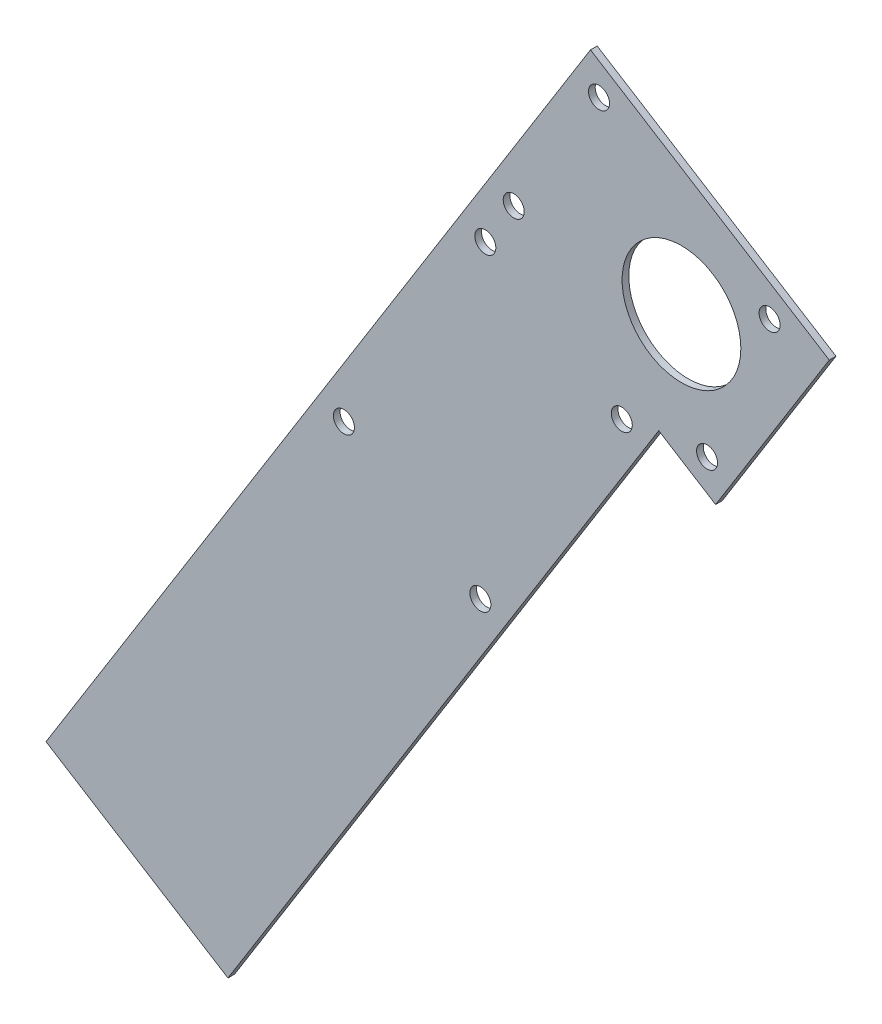
ISO-10303-21;
HEADER;
FILE_DESCRIPTION(('STEP AP214'),'2;1');
FILE_NAME('part.step','',(''),(''),'','','');
FILE_SCHEMA(('AUTOMOTIVE_DESIGN { 1 0 10303 214 1 1 1 1 }'));
ENDSEC;
DATA;
#1=APPLICATION_CONTEXT('core data for automotive mechanical design processes');
#2=APPLICATION_PROTOCOL_DEFINITION('international standard','automotive_design',2000,#1);
#3=PRODUCT_CONTEXT('',#1,'mechanical');
#4=PRODUCT('Part','Part','',(#3));
#5=PRODUCT_RELATED_PRODUCT_CATEGORY('part','',(#4));
#6=PRODUCT_DEFINITION_FORMATION('','',#4);
#7=PRODUCT_DEFINITION_CONTEXT('part definition',#1,'design');
#8=PRODUCT_DEFINITION('design','',#6,#7);
#9=PRODUCT_DEFINITION_SHAPE('','',#8);
#10=(LENGTH_UNIT() NAMED_UNIT(*) SI_UNIT(.MILLI.,.METRE.));
#11=(NAMED_UNIT(*) PLANE_ANGLE_UNIT() SI_UNIT($,.RADIAN.));
#12=(NAMED_UNIT(*) SI_UNIT($,.STERADIAN.) SOLID_ANGLE_UNIT());
#13=UNCERTAINTY_MEASURE_WITH_UNIT(LENGTH_MEASURE(1.E-05),#10,'distance_accuracy_value','');
#14=(GEOMETRIC_REPRESENTATION_CONTEXT(3) GLOBAL_UNCERTAINTY_ASSIGNED_CONTEXT((#13)) GLOBAL_UNIT_ASSIGNED_CONTEXT((#10,
#11,#12)) REPRESENTATION_CONTEXT('',''));
#15=CARTESIAN_POINT('',(0.,0.,0.));
#16=DIRECTION('',(0.,0.,1.));
#17=DIRECTION('',(1.,0.,0.));
#18=AXIS2_PLACEMENT_3D('',#15,#16,#17);
#19=CARTESIAN_POINT('',(14.1408265628746,-61.2506491733274,374.386380443167));
#20=DIRECTION('',(-0.848048096019243,0.529919264452743,0.));
#21=DIRECTION('',(-0.529919264452743,-0.848048096019243,0.));
#22=AXIS2_PLACEMENT_3D('',#19,#20,#21);
#23=PLANE('',#22);
#24=DIRECTION('',(-0.529919264452743,-0.848048096019243,0.));
#25=VECTOR('',#24,1.);
#26=CARTESIAN_POINT('',(14.1408265628746,-61.2506491733274,375.973880443167));
#27=LINE('',#26,#25);
#28=CARTESIAN_POINT('',(14.1408265628746,-61.2506491733274,375.973880443167));
#29=VERTEX_POINT('',#28);
#30=CARTESIAN_POINT('',(-87.8513112735362,-224.472188949626,375.973880443167));
#31=VERTEX_POINT('',#30);
#32=EDGE_CURVE('E121',#29,#31,#27,.T.);
#33=ORIENTED_EDGE('',*,*,#32,.T.);
#34=DIRECTION('',(0.,0.,1.));
#35=VECTOR('',#34,1.);
#36=CARTESIAN_POINT('',(-87.8513112735362,-224.472188949626,374.386380443167));
#37=LINE('',#36,#35);
#38=CARTESIAN_POINT('',(-87.8513112735362,-224.472188949626,374.386380443167));
#39=VERTEX_POINT('',#38);
#40=EDGE_CURVE('E11',#39,#31,#37,.T.);
#41=ORIENTED_EDGE('',*,*,#40,.F.);
#42=DIRECTION('',(-0.529919264452743,-0.848048096019243,0.));
#43=VECTOR('',#42,1.);
#44=CARTESIAN_POINT('',(14.1408265628746,-61.2506491733274,374.386380443167));
#45=LINE('',#44,#43);
#46=CARTESIAN_POINT('',(14.1408265628746,-61.2506491733274,374.386380443167));
#47=VERTEX_POINT('',#46);
#48=EDGE_CURVE('E132',#47,#39,#45,.T.);
#49=ORIENTED_EDGE('',*,*,#48,.F.);
#50=DIRECTION('',(0.,0.,1.));
#51=VECTOR('',#50,1.);
#52=CARTESIAN_POINT('',(14.1408265628746,-61.2506491733274,374.386380443167));
#53=LINE('',#52,#51);
#54=EDGE_CURVE('E117',#47,#29,#53,.T.);
#55=ORIENTED_EDGE('',*,*,#54,.T.);
#56=EDGE_LOOP('',(#33,#41,#49,#55));
#57=FACE_BOUND('',#56,.T.);
#58=ADVANCED_FACE('F37',(#57),#23,.F.);
#59=CARTESIAN_POINT('',(-87.8513112735362,-224.472188949626,374.386380443167));
#60=DIRECTION('',(0.529919264452743,0.848048096019244,0.));
#61=DIRECTION('',(-0.848048096019244,0.529919264452743,0.));
#62=AXIS2_PLACEMENT_3D('',#59,#60,#61);
#63=PLANE('',#62);
#64=DIRECTION('',(-0.848048096019244,0.529919264452743,0.));
#65=VECTOR('',#64,1.);
#66=CARTESIAN_POINT('',(-87.8513112735362,-224.472188949626,375.973880443167));
#67=LINE('',#66,#65);
#68=CARTESIAN_POINT('',(-130.932154551314,-197.552290315427,375.973880443167));
#69=VERTEX_POINT('',#68);
#70=EDGE_CURVE('E124',#31,#69,#67,.T.);
#71=ORIENTED_EDGE('',*,*,#70,.T.);
#72=DIRECTION('',(0.,0.,1.));
#73=VECTOR('',#72,1.);
#74=CARTESIAN_POINT('',(-130.932154551314,-197.552290315427,374.386380443167));
#75=LINE('',#74,#73);
#76=CARTESIAN_POINT('',(-130.932154551314,-197.552290315427,374.386380443167));
#77=VERTEX_POINT('',#76);
#78=EDGE_CURVE('E45',#77,#69,#75,.T.);
#79=ORIENTED_EDGE('',*,*,#78,.F.);
#80=DIRECTION('',(-0.848048096019244,0.529919264452743,0.));
#81=VECTOR('',#80,1.);
#82=CARTESIAN_POINT('',(-87.8513112735362,-224.472188949626,374.386380443167));
#83=LINE('',#82,#81);
#84=EDGE_CURVE('E90',#39,#77,#83,.T.);
#85=ORIENTED_EDGE('',*,*,#84,.F.);
#86=ORIENTED_EDGE('',*,*,#40,.T.);
#87=EDGE_LOOP('',(#71,#79,#85,#86));
#88=FACE_BOUND('',#87,.T.);
#89=ADVANCED_FACE('F157',(#88),#63,.F.);
#90=CARTESIAN_POINT('',(-130.932154551314,-197.552290315427,374.386380443167));
#91=DIRECTION('',(0.848048096019243,-0.529919264452744,0.));
#92=DIRECTION('',(0.529919264452744,0.848048096019243,0.));
#93=AXIS2_PLACEMENT_3D('',#90,#91,#92);
#94=PLANE('',#93);
#95=DIRECTION('',(0.529919264452744,0.848048096019243,0.));
#96=VECTOR('',#95,1.);
#97=CARTESIAN_POINT('',(-130.932154551314,-197.552290315427,375.973880443167));
#98=LINE('',#97,#96);
#99=CARTESIAN_POINT('',(-2.02011808070356,8.75009273864942,375.973880443167));
#100=VERTEX_POINT('',#99);
#101=EDGE_CURVE('E127',#69,#100,#98,.T.);
#102=ORIENTED_EDGE('',*,*,#101,.T.);
#103=DIRECTION('',(0.,0.,1.));
#104=VECTOR('',#103,1.);
#105=CARTESIAN_POINT('',(-2.02011808070356,8.75009273864942,374.386380443167));
#106=LINE('',#105,#104);
#107=CARTESIAN_POINT('',(-2.02011808070356,8.75009273864942,374.386380443167));
#108=VERTEX_POINT('',#107);
#109=EDGE_CURVE('E112',#108,#100,#106,.T.);
#110=ORIENTED_EDGE('',*,*,#109,.F.);
#111=DIRECTION('',(0.529919264452744,0.848048096019243,0.));
#112=VECTOR('',#111,1.);
#113=CARTESIAN_POINT('',(-130.932154551314,-197.552290315427,374.386380443167));
#114=LINE('',#113,#112);
#115=EDGE_CURVE('E103',#77,#108,#114,.T.);
#116=ORIENTED_EDGE('',*,*,#115,.F.);
#117=ORIENTED_EDGE('',*,*,#78,.T.);
#118=EDGE_LOOP('',(#102,#110,#116,#117));
#119=FACE_BOUND('',#118,.T.);
#120=ADVANCED_FACE('F138',(#119),#94,.F.);
#121=CARTESIAN_POINT('',(-2.02011808070356,8.75009273864942,374.386380443167));
#122=DIRECTION('',(-0.529919264452743,-0.848048096019244,0.));
#123=DIRECTION('',(0.848048096019244,-0.529919264452743,0.));
#124=AXIS2_PLACEMENT_3D('',#121,#122,#123);
#125=PLANE('',#124);
#126=DIRECTION('',(0.848048096019244,-0.529919264452743,0.));
#127=VECTOR('',#126,1.);
#128=CARTESIAN_POINT('',(-2.02011808070356,8.75009273864942,375.973880443167));
#129=LINE('',#128,#127);
#130=CARTESIAN_POINT('',(54.5234887213794,-26.5822742187371,375.973880443167));
#131=VERTEX_POINT('',#130);
#132=EDGE_CURVE('E111',#100,#131,#129,.T.);
#133=ORIENTED_EDGE('',*,*,#132,.T.);
#134=DIRECTION('',(0.,0.,1.));
#135=VECTOR('',#134,1.);
#136=CARTESIAN_POINT('',(54.5234887213794,-26.5822742187371,374.386380443167));
#137=LINE('',#136,#135);
#138=CARTESIAN_POINT('',(54.5234887213794,-26.5822742187371,374.386380443167));
#139=VERTEX_POINT('',#138);
#140=EDGE_CURVE('E108',#139,#131,#137,.T.);
#141=ORIENTED_EDGE('',*,*,#140,.F.);
#142=DIRECTION('',(0.848048096019244,-0.529919264452743,0.));
#143=VECTOR('',#142,1.);
#144=CARTESIAN_POINT('',(-2.02011808070356,8.75009273864942,374.386380443167));
#145=LINE('',#144,#143);
#146=EDGE_CURVE('E97',#108,#139,#145,.T.);
#147=ORIENTED_EDGE('',*,*,#146,.F.);
#148=ORIENTED_EDGE('',*,*,#109,.T.);
#149=EDGE_LOOP('',(#133,#141,#147,#148));
#150=FACE_BOUND('',#149,.T.);
#151=ADVANCED_FACE('F109',(#150),#125,.F.);
#152=CARTESIAN_POINT('',(54.5234887213794,-26.5822742187371,374.386380443167));
#153=DIRECTION('',(-0.848048096019244,0.529919264452743,0.));
#154=DIRECTION('',(-0.529919264452743,-0.848048096019244,0.));
#155=AXIS2_PLACEMENT_3D('',#152,#153,#154);
#156=PLANE('',#155);
#157=DIRECTION('',(-0.529919264452743,-0.848048096019244,0.));
#158=VECTOR('',#157,1.);
#159=CARTESIAN_POINT('',(54.5234887213794,-26.5822742187371,375.973880443167));
#160=LINE('',#159,#158);
#161=CARTESIAN_POINT('',(27.6035900871801,-69.6631174965147,375.973880443167));
#162=VERTEX_POINT('',#161);
#163=EDGE_CURVE('E76',#131,#162,#160,.T.);
#164=ORIENTED_EDGE('',*,*,#163,.T.);
#165=DIRECTION('',(0.,0.,1.));
#166=VECTOR('',#165,1.);
#167=CARTESIAN_POINT('',(27.6035900871801,-69.6631174965147,374.386380443167));
#168=LINE('',#167,#166);
#169=CARTESIAN_POINT('',(27.6035900871801,-69.6631174965147,374.386380443167));
#170=VERTEX_POINT('',#169);
#171=EDGE_CURVE('E113',#170,#162,#168,.T.);
#172=ORIENTED_EDGE('',*,*,#171,.F.);
#173=DIRECTION('',(-0.529919264452743,-0.848048096019244,0.));
#174=VECTOR('',#173,1.);
#175=CARTESIAN_POINT('',(54.5234887213794,-26.5822742187371,374.386380443167));
#176=LINE('',#175,#174);
#177=EDGE_CURVE('E101',#139,#170,#176,.T.);
#178=ORIENTED_EDGE('',*,*,#177,.F.);
#179=ORIENTED_EDGE('',*,*,#140,.T.);
#180=EDGE_LOOP('',(#164,#172,#178,#179));
#181=FACE_BOUND('',#180,.T.);
#182=ADVANCED_FACE('F115',(#181),#156,.F.);
#183=CARTESIAN_POINT('',(27.6035900871801,-69.6631174965147,374.386380443167));
#184=DIRECTION('',(0.529919264452741,0.848048096019245,0.));
#185=DIRECTION('',(-0.848048096019245,0.529919264452741,0.));
#186=AXIS2_PLACEMENT_3D('',#183,#184,#185);
#187=PLANE('',#186);
#188=DIRECTION('',(-0.848048096019245,0.529919264452741,0.));
#189=VECTOR('',#188,1.);
#190=CARTESIAN_POINT('',(27.6035900871801,-69.6631174965147,375.973880443167));
#191=LINE('',#190,#189);
#192=EDGE_CURVE('E82',#162,#29,#191,.T.);
#193=ORIENTED_EDGE('',*,*,#192,.T.);
#194=ORIENTED_EDGE('',*,*,#54,.F.);
#195=DIRECTION('',(-0.848048096019245,0.529919264452741,0.));
#196=VECTOR('',#195,1.);
#197=CARTESIAN_POINT('',(27.6035900871801,-69.6631174965147,374.386380443167));
#198=LINE('',#197,#196);
#199=EDGE_CURVE('E53',#170,#47,#198,.T.);
#200=ORIENTED_EDGE('',*,*,#199,.F.);
#201=ORIENTED_EDGE('',*,*,#171,.T.);
#202=EDGE_LOOP('',(#193,#194,#200,#201));
#203=FACE_BOUND('',#202,.T.);
#204=ADVANCED_FACE('F145',(#203),#187,.F.);
#205=CARTESIAN_POINT('',(2.9027570314928E-13,-3.09188045019151E-13,374.386380443167));
#206=DIRECTION('',(0.,0.,-1.));
#207=DIRECTION('',(0.,1.,0.));
#208=AXIS2_PLACEMENT_3D('',#205,#206,#207);
#209=PLANE('',#208);
#210=CARTESIAN_POINT('',(19.5231181961993,-34.6627468097252,374.386380443167));
#211=DIRECTION('',(0.,0.,-1.));
#212=DIRECTION('',(0.,1.,0.));
#213=AXIS2_PLACEMENT_3D('',#210,#211,#212);
#214=CIRCLE('',#213,14.0571693338688);
#215=CARTESIAN_POINT('',(19.5231181961993,-20.6055774758563,374.386380443167));
#216=VERTEX_POINT('',#215);
#217=EDGE_CURVE('E338',#216,#216,#214,.T.);
#218=ORIENTED_EDGE('',*,*,#217,.F.);
#219=EDGE_LOOP('',(#218));
#220=FACE_BOUND('',#219,.T.);
#221=CARTESIAN_POINT('',(5.39073382387738,-63.2707672537747,374.386380443167));
#222=DIRECTION('',(0.,0.,-1.));
#223=DIRECTION('',(0.,1.,0.));
#224=AXIS2_PLACEMENT_3D('',#221,#222,#223);
#225=CIRCLE('',#224,2.48919999999999);
#226=CARTESIAN_POINT('',(5.39073382387738,-60.7815672537747,374.386380443167));
#227=VERTEX_POINT('',#226);
#228=EDGE_CURVE('E343',#227,#227,#225,.T.);
#229=ORIENTED_EDGE('',*,*,#228,.F.);
#230=EDGE_LOOP('',(#229));
#231=FACE_BOUND('',#230,.T.);
#232=CARTESIAN_POINT('',(25.5834720065577,-60.9130247574083,374.386380443167));
#233=DIRECTION('',(0.,0.,-1.));
#234=DIRECTION('',(0.,1.,0.));
#235=AXIS2_PLACEMENT_3D('',#232,#233,#234);
#236=CIRCLE('',#235,2.48919999999999);
#237=CARTESIAN_POINT('',(25.5834720065577,-58.4238247574083,374.386380443167));
#238=VERTEX_POINT('',#237);
#239=EDGE_CURVE('E351',#238,#238,#236,.T.);
#240=ORIENTED_EDGE('',*,*,#239,.F.);
#241=EDGE_LOOP('',(#240));
#242=FACE_BOUND('',#241,.T.);
#243=CARTESIAN_POINT('',(40.388290572488,-25.237404969801,374.386380443167));
#244=DIRECTION('',(0.,0.,-1.));
#245=DIRECTION('',(0.,1.,0.));
#246=AXIS2_PLACEMENT_3D('',#243,#244,#245);
#247=CIRCLE('',#246,2.48919999999999);
#248=CARTESIAN_POINT('',(40.388290572488,-22.748204969801,374.386380443167));
#249=VERTEX_POINT('',#248);
#250=EDGE_CURVE('E357',#249,#249,#247,.T.);
#251=ORIENTED_EDGE('',*,*,#250,.F.);
#252=EDGE_LOOP('',(#251));
#253=FACE_BOUND('',#252,.T.);
#254=CARTESIAN_POINT('',(-4.2847841065282E-10,-2.39450405237554E-10,374.386380443167));
#255=DIRECTION('',(0.,0.,-1.));
#256=DIRECTION('',(0.,1.,0.));
#257=AXIS2_PLACEMENT_3D('',#254,#255,#256);
#258=CIRCLE('',#257,2.48919999999999);
#259=CARTESIAN_POINT('',(-4.2847841065282E-10,2.48919999976054,374.386380443167));
#260=VERTEX_POINT('',#259);
#261=EDGE_CURVE('E363',#260,#260,#258,.T.);
#262=ORIENTED_EDGE('',*,*,#261,.F.);
#263=EDGE_LOOP('',(#262));
#264=FACE_BOUND('',#263,.T.);
#265=CARTESIAN_POINT('',(-20.189923976081,-32.3106324585717,374.386380443167));
#266=DIRECTION('',(0.,0.,-1.));
#267=DIRECTION('',(0.,1.,0.));
#268=AXIS2_PLACEMENT_3D('',#265,#266,#267);
#269=CIRCLE('',#268,2.48919999999999);
#270=CARTESIAN_POINT('',(-20.189923976081,-29.8214324585717,374.386380443167));
#271=VERTEX_POINT('',#270);
#272=EDGE_CURVE('E369',#271,#271,#269,.T.);
#273=ORIENTED_EDGE('',*,*,#272,.F.);
#274=EDGE_LOOP('',(#273));
#275=FACE_BOUND('',#274,.T.);
#276=CARTESIAN_POINT('',(-26.9198986344563,-43.080843278126,374.386380443167));
#277=DIRECTION('',(0.,0.,-1.));
#278=DIRECTION('',(0.,1.,0.));
#279=AXIS2_PLACEMENT_3D('',#276,#277,#278);
#280=CIRCLE('',#279,2.48919999999999);
#281=CARTESIAN_POINT('',(-26.9198986344563,-40.591643278126,374.386380443167));
#282=VERTEX_POINT('',#281);
#283=EDGE_CURVE('E375',#282,#282,#280,.T.);
#284=ORIENTED_EDGE('',*,*,#283,.F.);
#285=EDGE_LOOP('',(#284));
#286=FACE_BOUND('',#285,.T.);
#287=CARTESIAN_POINT('',(-60.4038648118432,-96.6663904901761,374.386380443167));
#288=DIRECTION('',(0.,0.,-1.));
#289=DIRECTION('',(0.,1.,0.));
#290=AXIS2_PLACEMENT_3D('',#287,#288,#289);
#291=CIRCLE('',#290,2.48919999999999);
#292=CARTESIAN_POINT('',(-60.4038648118432,-94.1771904901761,374.386380443167));
#293=VERTEX_POINT('',#292);
#294=EDGE_CURVE('E381',#293,#293,#291,.T.);
#295=ORIENTED_EDGE('',*,*,#294,.F.);
#296=EDGE_LOOP('',(#295));
#297=FACE_BOUND('',#296,.T.);
#298=CARTESIAN_POINT('',(-28.0932323535118,-116.856314465824,374.386380443167));
#299=DIRECTION('',(0.,0.,-1.));
#300=DIRECTION('',(0.,1.,0.));
#301=AXIS2_PLACEMENT_3D('',#298,#299,#300);
#302=CIRCLE('',#301,2.48919999999999);
#303=CARTESIAN_POINT('',(-28.0932323535118,-114.367114465824,374.386380443167));
#304=VERTEX_POINT('',#303);
#305=EDGE_CURVE('E387',#304,#304,#302,.T.);
#306=ORIENTED_EDGE('',*,*,#305,.F.);
#307=EDGE_LOOP('',(#306));
#308=FACE_BOUND('',#307,.T.);
#309=ORIENTED_EDGE('',*,*,#48,.T.);
#310=ORIENTED_EDGE('',*,*,#84,.T.);
#311=ORIENTED_EDGE('',*,*,#115,.T.);
#312=ORIENTED_EDGE('',*,*,#146,.T.);
#313=ORIENTED_EDGE('',*,*,#177,.T.);
#314=ORIENTED_EDGE('',*,*,#199,.T.);
#315=EDGE_LOOP('',(#309,#310,#311,#312,#313,#314));
#316=FACE_BOUND('',#315,.T.);
#317=ADVANCED_FACE('F99',(#220,#231,#242,#253,#264,#275,#286,#297,#308,#316),#209,.T.);
#318=CARTESIAN_POINT('',(2.90949955132933E-13,-3.09673287808542E-13,375.973880443167));
#319=DIRECTION('',(0.,0.,-1.));
#320=DIRECTION('',(0.,1.,0.));
#321=AXIS2_PLACEMENT_3D('',#318,#319,#320);
#322=PLANE('',#321);
#323=CARTESIAN_POINT('',(19.5231181961993,-34.6627468097252,375.973880443167));
#324=DIRECTION('',(0.,0.,1.));
#325=DIRECTION('',(1.,0.,0.));
#326=AXIS2_PLACEMENT_3D('',#323,#324,#325);
#327=CIRCLE('',#326,14.0571693338688);
#328=CARTESIAN_POINT('',(33.5802875300681,-34.6627468097252,375.973880443167));
#329=VERTEX_POINT('',#328);
#330=EDGE_CURVE('E341',#329,#329,#327,.T.);
#331=ORIENTED_EDGE('',*,*,#330,.F.);
#332=EDGE_LOOP('',(#331));
#333=FACE_BOUND('',#332,.T.);
#334=CARTESIAN_POINT('',(5.39073382387738,-63.2707672537747,375.973880443168));
#335=DIRECTION('',(0.,0.,-1.));
#336=DIRECTION('',(0.,1.,0.));
#337=AXIS2_PLACEMENT_3D('',#334,#335,#336);
#338=CIRCLE('',#337,2.4892);
#339=CARTESIAN_POINT('',(5.39073382387738,-60.7815672537747,375.973880443168));
#340=VERTEX_POINT('',#339);
#341=EDGE_CURVE('E348',#340,#340,#338,.T.);
#342=ORIENTED_EDGE('',*,*,#341,.T.);
#343=EDGE_LOOP('',(#342));
#344=FACE_BOUND('',#343,.T.);
#345=CARTESIAN_POINT('',(25.5834720065577,-60.9130247574083,375.973880443167));
#346=DIRECTION('',(0.,0.,-1.));
#347=DIRECTION('',(0.,1.,0.));
#348=AXIS2_PLACEMENT_3D('',#345,#346,#347);
#349=CIRCLE('',#348,2.4892);
#350=CARTESIAN_POINT('',(25.5834720065577,-58.4238247574083,375.973880443167));
#351=VERTEX_POINT('',#350);
#352=EDGE_CURVE('E354',#351,#351,#349,.T.);
#353=ORIENTED_EDGE('',*,*,#352,.T.);
#354=EDGE_LOOP('',(#353));
#355=FACE_BOUND('',#354,.T.);
#356=CARTESIAN_POINT('',(40.388290572488,-25.237404969801,375.973880443168));
#357=DIRECTION('',(0.,0.,-1.));
#358=DIRECTION('',(0.,1.,0.));
#359=AXIS2_PLACEMENT_3D('',#356,#357,#358);
#360=CIRCLE('',#359,2.4892);
#361=CARTESIAN_POINT('',(40.388290572488,-22.748204969801,375.973880443168));
#362=VERTEX_POINT('',#361);
#363=EDGE_CURVE('E360',#362,#362,#360,.T.);
#364=ORIENTED_EDGE('',*,*,#363,.T.);
#365=EDGE_LOOP('',(#364));
#366=FACE_BOUND('',#365,.T.);
#367=CARTESIAN_POINT('',(-4.2847841065282E-10,-2.39450864869248E-10,375.973880443168));
#368=DIRECTION('',(0.,0.,-1.));
#369=DIRECTION('',(0.,1.,0.));
#370=AXIS2_PLACEMENT_3D('',#367,#368,#369);
#371=CIRCLE('',#370,2.4892);
#372=CARTESIAN_POINT('',(-4.2847841065282E-10,2.48919999976055,375.973880443168));
#373=VERTEX_POINT('',#372);
#374=EDGE_CURVE('E366',#373,#373,#371,.T.);
#375=ORIENTED_EDGE('',*,*,#374,.T.);
#376=EDGE_LOOP('',(#375));
#377=FACE_BOUND('',#376,.T.);
#378=CARTESIAN_POINT('',(-20.189923976081,-32.3106324585717,375.973880443168));
#379=DIRECTION('',(0.,0.,-1.));
#380=DIRECTION('',(0.,1.,0.));
#381=AXIS2_PLACEMENT_3D('',#378,#379,#380);
#382=CIRCLE('',#381,2.4892);
#383=CARTESIAN_POINT('',(-20.189923976081,-29.8214324585717,375.973880443168));
#384=VERTEX_POINT('',#383);
#385=EDGE_CURVE('E372',#384,#384,#382,.T.);
#386=ORIENTED_EDGE('',*,*,#385,.T.);
#387=EDGE_LOOP('',(#386));
#388=FACE_BOUND('',#387,.T.);
#389=CARTESIAN_POINT('',(-26.9198986344563,-43.080843278126,375.973880443168));
#390=DIRECTION('',(0.,0.,-1.));
#391=DIRECTION('',(0.,1.,0.));
#392=AXIS2_PLACEMENT_3D('',#389,#390,#391);
#393=CIRCLE('',#392,2.4892);
#394=CARTESIAN_POINT('',(-26.9198986344563,-40.591643278126,375.973880443168));
#395=VERTEX_POINT('',#394);
#396=EDGE_CURVE('E378',#395,#395,#393,.T.);
#397=ORIENTED_EDGE('',*,*,#396,.T.);
#398=EDGE_LOOP('',(#397));
#399=FACE_BOUND('',#398,.T.);
#400=CARTESIAN_POINT('',(-60.4038648118432,-96.6663904901761,375.973880443168));
#401=DIRECTION('',(0.,0.,-1.));
#402=DIRECTION('',(0.,1.,0.));
#403=AXIS2_PLACEMENT_3D('',#400,#401,#402);
#404=CIRCLE('',#403,2.4892);
#405=CARTESIAN_POINT('',(-60.4038648118432,-94.1771904901761,375.973880443168));
#406=VERTEX_POINT('',#405);
#407=EDGE_CURVE('E384',#406,#406,#404,.T.);
#408=ORIENTED_EDGE('',*,*,#407,.T.);
#409=EDGE_LOOP('',(#408));
#410=FACE_BOUND('',#409,.T.);
#411=CARTESIAN_POINT('',(-28.0932323535118,-116.856314465824,375.973880443168));
#412=DIRECTION('',(0.,0.,-1.));
#413=DIRECTION('',(0.,1.,0.));
#414=AXIS2_PLACEMENT_3D('',#411,#412,#413);
#415=CIRCLE('',#414,2.4892);
#416=CARTESIAN_POINT('',(-28.0932323535118,-114.367114465824,375.973880443168));
#417=VERTEX_POINT('',#416);
#418=EDGE_CURVE('E125',#417,#417,#415,.T.);
#419=ORIENTED_EDGE('',*,*,#418,.T.);
#420=EDGE_LOOP('',(#419));
#421=FACE_BOUND('',#420,.T.);
#422=ORIENTED_EDGE('',*,*,#32,.F.);
#423=ORIENTED_EDGE('',*,*,#192,.F.);
#424=ORIENTED_EDGE('',*,*,#163,.F.);
#425=ORIENTED_EDGE('',*,*,#132,.F.);
#426=ORIENTED_EDGE('',*,*,#101,.F.);
#427=ORIENTED_EDGE('',*,*,#70,.F.);
#428=EDGE_LOOP('',(#422,#423,#424,#425,#426,#427));
#429=FACE_BOUND('',#428,.T.);
#430=ADVANCED_FACE('F141',(#333,#344,#355,#366,#377,#388,#399,#410,#421,#429),#322,.F.);
#431=CARTESIAN_POINT('',(-28.0932323535118,-116.856314465824,374.386380443167));
#432=DIRECTION('',(0.,0.,-1.));
#433=DIRECTION('',(0.,1.,0.));
#434=AXIS2_PLACEMENT_3D('',#431,#432,#433);
#435=CYLINDRICAL_SURFACE('',#434,2.48919999999999);
#436=ORIENTED_EDGE('',*,*,#418,.F.);
#437=EDGE_LOOP('',(#436));
#438=FACE_BOUND('',#437,.T.);
#439=ORIENTED_EDGE('',*,*,#305,.T.);
#440=EDGE_LOOP('',(#439));
#441=FACE_BOUND('',#440,.T.);
#442=ADVANCED_FACE('F187',(#438,#441),#435,.F.);
#443=CARTESIAN_POINT('',(-60.4038648118432,-96.6663904901761,374.386380443167));
#444=DIRECTION('',(0.,0.,-1.));
#445=DIRECTION('',(0.,1.,0.));
#446=AXIS2_PLACEMENT_3D('',#443,#444,#445);
#447=CYLINDRICAL_SURFACE('',#446,2.48919999999999);
#448=ORIENTED_EDGE('',*,*,#407,.F.);
#449=EDGE_LOOP('',(#448));
#450=FACE_BOUND('',#449,.T.);
#451=ORIENTED_EDGE('',*,*,#294,.T.);
#452=EDGE_LOOP('',(#451));
#453=FACE_BOUND('',#452,.T.);
#454=ADVANCED_FACE('F192',(#450,#453),#447,.F.);
#455=CARTESIAN_POINT('',(-26.9198986344563,-43.080843278126,374.386380443167));
#456=DIRECTION('',(0.,0.,-1.));
#457=DIRECTION('',(0.,1.,0.));
#458=AXIS2_PLACEMENT_3D('',#455,#456,#457);
#459=CYLINDRICAL_SURFACE('',#458,2.4892);
#460=ORIENTED_EDGE('',*,*,#396,.F.);
#461=EDGE_LOOP('',(#460));
#462=FACE_BOUND('',#461,.T.);
#463=ORIENTED_EDGE('',*,*,#283,.T.);
#464=EDGE_LOOP('',(#463));
#465=FACE_BOUND('',#464,.T.);
#466=ADVANCED_FACE('F205',(#462,#465),#459,.F.);
#467=CARTESIAN_POINT('',(-20.189923976081,-32.3106324585717,374.386380443167));
#468=DIRECTION('',(0.,0.,-1.));
#469=DIRECTION('',(0.,1.,0.));
#470=AXIS2_PLACEMENT_3D('',#467,#468,#469);
#471=CYLINDRICAL_SURFACE('',#470,2.4892);
#472=ORIENTED_EDGE('',*,*,#385,.F.);
#473=EDGE_LOOP('',(#472));
#474=FACE_BOUND('',#473,.T.);
#475=ORIENTED_EDGE('',*,*,#272,.T.);
#476=EDGE_LOOP('',(#475));
#477=FACE_BOUND('',#476,.T.);
#478=ADVANCED_FACE('F216',(#474,#477),#471,.F.);
#479=CARTESIAN_POINT('',(-4.2847841065282E-10,-2.39450405237554E-10,374.386380443167));
#480=DIRECTION('',(0.,0.,-1.));
#481=DIRECTION('',(0.,1.,0.));
#482=AXIS2_PLACEMENT_3D('',#479,#480,#481);
#483=CYLINDRICAL_SURFACE('',#482,2.48919999999999);
#484=ORIENTED_EDGE('',*,*,#374,.F.);
#485=EDGE_LOOP('',(#484));
#486=FACE_BOUND('',#485,.T.);
#487=ORIENTED_EDGE('',*,*,#261,.T.);
#488=EDGE_LOOP('',(#487));
#489=FACE_BOUND('',#488,.T.);
#490=ADVANCED_FACE('F227',(#486,#489),#483,.F.);
#491=CARTESIAN_POINT('',(40.388290572488,-25.237404969801,374.386380443167));
#492=DIRECTION('',(0.,0.,-1.));
#493=DIRECTION('',(0.,1.,0.));
#494=AXIS2_PLACEMENT_3D('',#491,#492,#493);
#495=CYLINDRICAL_SURFACE('',#494,2.48919999999999);
#496=ORIENTED_EDGE('',*,*,#363,.F.);
#497=EDGE_LOOP('',(#496));
#498=FACE_BOUND('',#497,.T.);
#499=ORIENTED_EDGE('',*,*,#250,.T.);
#500=EDGE_LOOP('',(#499));
#501=FACE_BOUND('',#500,.T.);
#502=ADVANCED_FACE('F238',(#498,#501),#495,.F.);
#503=CARTESIAN_POINT('',(25.5834720065577,-60.9130247574083,374.386380443167));
#504=DIRECTION('',(0.,0.,-1.));
#505=DIRECTION('',(0.,1.,0.));
#506=AXIS2_PLACEMENT_3D('',#503,#504,#505);
#507=CYLINDRICAL_SURFACE('',#506,2.48919999999999);
#508=ORIENTED_EDGE('',*,*,#352,.F.);
#509=EDGE_LOOP('',(#508));
#510=FACE_BOUND('',#509,.T.);
#511=ORIENTED_EDGE('',*,*,#239,.T.);
#512=EDGE_LOOP('',(#511));
#513=FACE_BOUND('',#512,.T.);
#514=ADVANCED_FACE('F249',(#510,#513),#507,.F.);
#515=CARTESIAN_POINT('',(5.39073382387738,-63.2707672537747,374.386380443167));
#516=DIRECTION('',(0.,0.,-1.));
#517=DIRECTION('',(0.,1.,0.));
#518=AXIS2_PLACEMENT_3D('',#515,#516,#517);
#519=CYLINDRICAL_SURFACE('',#518,2.48919999999999);
#520=ORIENTED_EDGE('',*,*,#341,.F.);
#521=EDGE_LOOP('',(#520));
#522=FACE_BOUND('',#521,.T.);
#523=ORIENTED_EDGE('',*,*,#228,.T.);
#524=EDGE_LOOP('',(#523));
#525=FACE_BOUND('',#524,.T.);
#526=ADVANCED_FACE('F260',(#522,#525),#519,.F.);
#527=CARTESIAN_POINT('',(19.5231181961993,-34.6627468097252,373.433880443167));
#528=DIRECTION('',(0.,0.,1.));
#529=DIRECTION('',(1.,0.,0.));
#530=AXIS2_PLACEMENT_3D('',#527,#528,#529);
#531=CYLINDRICAL_SURFACE('',#530,14.0571693338688);
#532=ORIENTED_EDGE('',*,*,#217,.T.);
#533=EDGE_LOOP('',(#532));
#534=FACE_BOUND('',#533,.T.);
#535=ORIENTED_EDGE('',*,*,#330,.T.);
#536=EDGE_LOOP('',(#535));
#537=FACE_BOUND('',#536,.T.);
#538=ADVANCED_FACE('F271',(#534,#537),#531,.F.);
#539=CLOSED_SHELL('',(#58,#89,#120,#151,#182,#204,#317,#430,#442,#454,#466,#478,#490,#502,#514,
#526,#538));
#540=MANIFOLD_SOLID_BREP('B2',#539);
#541=ADVANCED_BREP_SHAPE_REPRESENTATION('',(#18,#540),#14);
#542=SHAPE_DEFINITION_REPRESENTATION(#9,#541);
ENDSEC;
END-ISO-10303-21;
